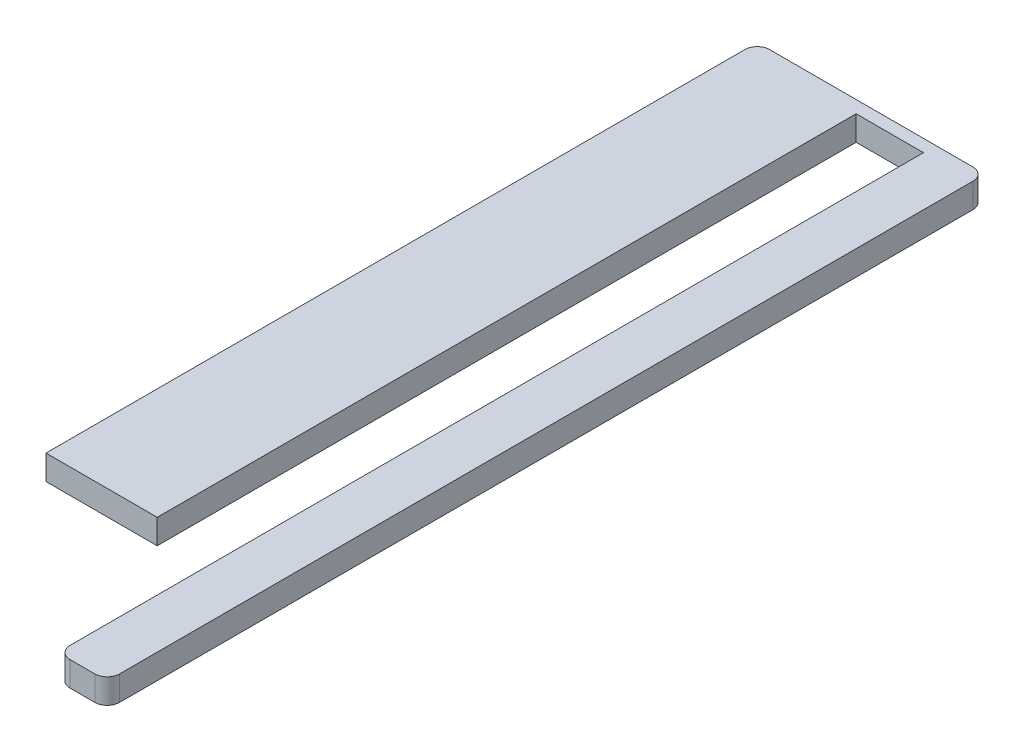
ISO-10303-21;
HEADER;
FILE_DESCRIPTION(('STEP AP214'),'2;1');
FILE_NAME('part.step','',(''),(''),'','','');
FILE_SCHEMA(('AUTOMOTIVE_DESIGN { 1 0 10303 214 1 1 1 1 }'));
ENDSEC;
DATA;
#1=APPLICATION_CONTEXT('core data for automotive mechanical design processes');
#2=APPLICATION_PROTOCOL_DEFINITION('international standard','automotive_design',2000,#1);
#3=PRODUCT_CONTEXT('',#1,'mechanical');
#4=PRODUCT('Part','Part','',(#3));
#5=PRODUCT_RELATED_PRODUCT_CATEGORY('part','',(#4));
#6=PRODUCT_DEFINITION_FORMATION('','',#4);
#7=PRODUCT_DEFINITION_CONTEXT('part definition',#1,'design');
#8=PRODUCT_DEFINITION('design','',#6,#7);
#9=PRODUCT_DEFINITION_SHAPE('','',#8);
#10=(LENGTH_UNIT() NAMED_UNIT(*) SI_UNIT(.MILLI.,.METRE.));
#11=(NAMED_UNIT(*) PLANE_ANGLE_UNIT() SI_UNIT($,.RADIAN.));
#12=(NAMED_UNIT(*) SI_UNIT($,.STERADIAN.) SOLID_ANGLE_UNIT());
#13=UNCERTAINTY_MEASURE_WITH_UNIT(LENGTH_MEASURE(1.E-05),#10,'distance_accuracy_value','');
#14=(GEOMETRIC_REPRESENTATION_CONTEXT(3) GLOBAL_UNCERTAINTY_ASSIGNED_CONTEXT((#13)) GLOBAL_UNIT_ASSIGNED_CONTEXT((#10,
#11,#12)) REPRESENTATION_CONTEXT('',''));
#15=CARTESIAN_POINT('',(0.,0.,0.));
#16=DIRECTION('',(0.,0.,1.));
#17=DIRECTION('',(1.,0.,0.));
#18=AXIS2_PLACEMENT_3D('',#15,#16,#17);
#19=CARTESIAN_POINT('',(0.,2.,-56.55));
#20=DIRECTION('',(1.,0.,0.));
#21=DIRECTION('',(0.,0.,-1.));
#22=AXIS2_PLACEMENT_3D('',#19,#20,#21);
#23=PLANE('',#22);
#24=DIRECTION('',(0.,0.,1.));
#25=VECTOR('',#24,1.);
#26=CARTESIAN_POINT('',(0.,0.,-56.55));
#27=LINE('',#26,#25);
#28=CARTESIAN_POINT('',(0.,0.,-56.55));
#29=VERTEX_POINT('',#28);
#30=CARTESIAN_POINT('',(0.,0.,0.));
#31=VERTEX_POINT('',#30);
#32=EDGE_CURVE('E170',#29,#31,#27,.T.);
#33=ORIENTED_EDGE('',*,*,#32,.T.);
#34=DIRECTION('',(0.,-1.,0.));
#35=VECTOR('',#34,1.);
#36=CARTESIAN_POINT('',(0.,2.,0.));
#37=LINE('',#36,#35);
#38=CARTESIAN_POINT('',(0.,2.,0.));
#39=VERTEX_POINT('',#38);
#40=EDGE_CURVE('E11',#39,#31,#37,.T.);
#41=ORIENTED_EDGE('',*,*,#40,.F.);
#42=DIRECTION('',(0.,0.,1.));
#43=VECTOR('',#42,1.);
#44=CARTESIAN_POINT('',(0.,2.,-56.55));
#45=LINE('',#44,#43);
#46=CARTESIAN_POINT('',(0.,2.,-56.55));
#47=VERTEX_POINT('',#46);
#48=EDGE_CURVE('E204',#47,#39,#45,.T.);
#49=ORIENTED_EDGE('',*,*,#48,.F.);
#50=DIRECTION('',(0.,-1.,0.));
#51=VECTOR('',#50,1.);
#52=CARTESIAN_POINT('',(0.,2.,-56.55));
#53=LINE('',#52,#51);
#54=EDGE_CURVE('E166',#47,#29,#53,.T.);
#55=ORIENTED_EDGE('',*,*,#54,.T.);
#56=EDGE_LOOP('',(#33,#41,#49,#55));
#57=FACE_BOUND('',#56,.T.);
#58=ADVANCED_FACE('F45',(#57),#23,.F.);
#59=CARTESIAN_POINT('',(0.,2.,0.));
#60=DIRECTION('',(0.,0.,-1.));
#61=DIRECTION('',(-1.,0.,0.));
#62=AXIS2_PLACEMENT_3D('',#59,#60,#61);
#63=PLANE('',#62);
#64=DIRECTION('',(1.,0.,0.));
#65=VECTOR('',#64,1.);
#66=CARTESIAN_POINT('',(0.,0.,0.));
#67=LINE('',#66,#65);
#68=CARTESIAN_POINT('',(9.,0.,0.));
#69=VERTEX_POINT('',#68);
#70=EDGE_CURVE('E174',#31,#69,#67,.T.);
#71=ORIENTED_EDGE('',*,*,#70,.T.);
#72=DIRECTION('',(0.,-1.,0.));
#73=VECTOR('',#72,1.);
#74=CARTESIAN_POINT('',(9.,2.,0.));
#75=LINE('',#74,#73);
#76=CARTESIAN_POINT('',(9.,2.,0.));
#77=VERTEX_POINT('',#76);
#78=EDGE_CURVE('E54',#77,#69,#75,.T.);
#79=ORIENTED_EDGE('',*,*,#78,.F.);
#80=DIRECTION('',(1.,0.,0.));
#81=VECTOR('',#80,1.);
#82=CARTESIAN_POINT('',(0.,2.,0.));
#83=LINE('',#82,#81);
#84=EDGE_CURVE('E117',#39,#77,#83,.T.);
#85=ORIENTED_EDGE('',*,*,#84,.F.);
#86=ORIENTED_EDGE('',*,*,#40,.T.);
#87=EDGE_LOOP('',(#71,#79,#85,#86));
#88=FACE_BOUND('',#87,.T.);
#89=ADVANCED_FACE('F298',(#88),#63,.F.);
#90=CARTESIAN_POINT('',(9.,2.,0.));
#91=DIRECTION('',(-1.,0.,0.));
#92=DIRECTION('',(0.,0.,1.));
#93=AXIS2_PLACEMENT_3D('',#90,#91,#92);
#94=PLANE('',#93);
#95=DIRECTION('',(0.,0.,-1.));
#96=VECTOR('',#95,1.);
#97=CARTESIAN_POINT('',(9.,0.,0.));
#98=LINE('',#97,#96);
#99=CARTESIAN_POINT('',(9.,0.,-56.55));
#100=VERTEX_POINT('',#99);
#101=EDGE_CURVE('E177',#69,#100,#98,.T.);
#102=ORIENTED_EDGE('',*,*,#101,.T.);
#103=DIRECTION('',(0.,-1.,0.));
#104=VECTOR('',#103,1.);
#105=CARTESIAN_POINT('',(9.,2.,-56.55));
#106=LINE('',#105,#104);
#107=CARTESIAN_POINT('',(9.,2.,-56.55));
#108=VERTEX_POINT('',#107);
#109=EDGE_CURVE('E231',#108,#100,#106,.T.);
#110=ORIENTED_EDGE('',*,*,#109,.F.);
#111=DIRECTION('',(0.,0.,-1.));
#112=VECTOR('',#111,1.);
#113=CARTESIAN_POINT('',(9.,2.,0.));
#114=LINE('',#113,#112);
#115=EDGE_CURVE('E241',#77,#108,#114,.T.);
#116=ORIENTED_EDGE('',*,*,#115,.F.);
#117=ORIENTED_EDGE('',*,*,#78,.T.);
#118=EDGE_LOOP('',(#102,#110,#116,#117));
#119=FACE_BOUND('',#118,.T.);
#120=ADVANCED_FACE('F239',(#119),#94,.F.);
#121=CARTESIAN_POINT('',(9.,2.,-56.55));
#122=DIRECTION('',(0.,0.,-1.));
#123=DIRECTION('',(-1.,0.,0.));
#124=AXIS2_PLACEMENT_3D('',#121,#122,#123);
#125=PLANE('',#124);
#126=DIRECTION('',(1.,0.,0.));
#127=VECTOR('',#126,1.);
#128=CARTESIAN_POINT('',(9.,0.,-56.55));
#129=LINE('',#128,#127);
#130=CARTESIAN_POINT('',(14.45,0.,-56.55));
#131=VERTEX_POINT('',#130);
#132=EDGE_CURVE('E180',#100,#131,#129,.T.);
#133=ORIENTED_EDGE('',*,*,#132,.T.);
#134=DIRECTION('',(0.,-1.,0.));
#135=VECTOR('',#134,1.);
#136=CARTESIAN_POINT('',(14.45,2.,-56.55));
#137=LINE('',#136,#135);
#138=CARTESIAN_POINT('',(14.45,2.,-56.55));
#139=VERTEX_POINT('',#138);
#140=EDGE_CURVE('E227',#139,#131,#137,.T.);
#141=ORIENTED_EDGE('',*,*,#140,.F.);
#142=DIRECTION('',(1.,0.,0.));
#143=VECTOR('',#142,1.);
#144=CARTESIAN_POINT('',(9.,2.,-56.55));
#145=LINE('',#144,#143);
#146=EDGE_CURVE('E260',#108,#139,#145,.T.);
#147=ORIENTED_EDGE('',*,*,#146,.F.);
#148=ORIENTED_EDGE('',*,*,#109,.T.);
#149=EDGE_LOOP('',(#133,#141,#147,#148));
#150=FACE_BOUND('',#149,.T.);
#151=ADVANCED_FACE('F250',(#150),#125,.F.);
#152=CARTESIAN_POINT('',(14.45,2.,-56.55));
#153=DIRECTION('',(1.,0.,0.));
#154=DIRECTION('',(0.,0.,-1.));
#155=AXIS2_PLACEMENT_3D('',#152,#153,#154);
#156=PLANE('',#155);
#157=DIRECTION('',(0.,0.,1.));
#158=VECTOR('',#157,1.);
#159=CARTESIAN_POINT('',(14.45,0.,-56.55));
#160=LINE('',#159,#158);
#161=CARTESIAN_POINT('',(14.45,0.,12.5));
#162=VERTEX_POINT('',#161);
#163=EDGE_CURVE('E183',#131,#162,#160,.T.);
#164=ORIENTED_EDGE('',*,*,#163,.T.);
#165=DIRECTION('',(0.,-1.,0.));
#166=VECTOR('',#165,1.);
#167=CARTESIAN_POINT('',(14.45,2.,12.5));
#168=LINE('',#167,#166);
#169=CARTESIAN_POINT('',(14.45,2.,12.5));
#170=VERTEX_POINT('',#169);
#171=EDGE_CURVE('E223',#170,#162,#168,.T.);
#172=ORIENTED_EDGE('',*,*,#171,.F.);
#173=DIRECTION('',(0.,0.,1.));
#174=VECTOR('',#173,1.);
#175=CARTESIAN_POINT('',(14.45,2.,-56.55));
#176=LINE('',#175,#174);
#177=EDGE_CURVE('E256',#139,#170,#176,.T.);
#178=ORIENTED_EDGE('',*,*,#177,.F.);
#179=ORIENTED_EDGE('',*,*,#140,.T.);
#180=EDGE_LOOP('',(#164,#172,#178,#179));
#181=FACE_BOUND('',#180,.T.);
#182=ADVANCED_FACE('F254',(#181),#156,.F.);
#183=CARTESIAN_POINT('',(15.45,2.,12.5));
#184=DIRECTION('',(0.,-1.,0.));
#185=DIRECTION('',(0.,0.,-1.));
#186=AXIS2_PLACEMENT_3D('',#183,#184,#185);
#187=CYLINDRICAL_SURFACE('',#186,1.);
#188=CARTESIAN_POINT('',(15.45,0.,12.5));
#189=DIRECTION('',(0.,1.,0.));
#190=DIRECTION('',(0.,0.,1.));
#191=AXIS2_PLACEMENT_3D('',#188,#189,#190);
#192=CIRCLE('',#191,1.);
#193=CARTESIAN_POINT('',(15.45,0.,13.5));
#194=VERTEX_POINT('',#193);
#195=EDGE_CURVE('E186',#162,#194,#192,.T.);
#196=ORIENTED_EDGE('',*,*,#195,.T.);
#197=DIRECTION('',(0.,-1.,0.));
#198=VECTOR('',#197,1.);
#199=CARTESIAN_POINT('',(15.45,2.,13.5));
#200=LINE('',#199,#198);
#201=CARTESIAN_POINT('',(15.45,2.,13.5));
#202=VERTEX_POINT('',#201);
#203=EDGE_CURVE('E219',#202,#194,#200,.T.);
#204=ORIENTED_EDGE('',*,*,#203,.F.);
#205=CARTESIAN_POINT('',(15.45,2.,12.5));
#206=DIRECTION('',(0.,1.,0.));
#207=DIRECTION('',(0.,0.,1.));
#208=AXIS2_PLACEMENT_3D('',#205,#206,#207);
#209=CIRCLE('',#208,1.);
#210=EDGE_CURVE('E259',#170,#202,#209,.T.);
#211=ORIENTED_EDGE('',*,*,#210,.F.);
#212=ORIENTED_EDGE('',*,*,#171,.T.);
#213=EDGE_LOOP('',(#196,#204,#211,#212));
#214=FACE_BOUND('',#213,.T.);
#215=ADVANCED_FACE('F311',(#214),#187,.T.);
#216=CARTESIAN_POINT('',(15.45,2.,13.5));
#217=DIRECTION('',(0.,0.,-1.));
#218=DIRECTION('',(-1.,0.,0.));
#219=AXIS2_PLACEMENT_3D('',#216,#217,#218);
#220=PLANE('',#219);
#221=DIRECTION('',(1.,0.,0.));
#222=VECTOR('',#221,1.);
#223=CARTESIAN_POINT('',(15.45,0.,13.5));
#224=LINE('',#223,#222);
#225=CARTESIAN_POINT('',(17.45,0.,13.5));
#226=VERTEX_POINT('',#225);
#227=EDGE_CURVE('E189',#194,#226,#224,.T.);
#228=ORIENTED_EDGE('',*,*,#227,.T.);
#229=DIRECTION('',(0.,-1.,0.));
#230=VECTOR('',#229,1.);
#231=CARTESIAN_POINT('',(17.45,2.,13.5));
#232=LINE('',#231,#230);
#233=CARTESIAN_POINT('',(17.45,2.,13.5));
#234=VERTEX_POINT('',#233);
#235=EDGE_CURVE('E215',#234,#226,#232,.T.);
#236=ORIENTED_EDGE('',*,*,#235,.F.);
#237=DIRECTION('',(1.,0.,0.));
#238=VECTOR('',#237,1.);
#239=CARTESIAN_POINT('',(15.45,2.,13.5));
#240=LINE('',#239,#238);
#241=EDGE_CURVE('E264',#202,#234,#240,.T.);
#242=ORIENTED_EDGE('',*,*,#241,.F.);
#243=ORIENTED_EDGE('',*,*,#203,.T.);
#244=EDGE_LOOP('',(#228,#236,#242,#243));
#245=FACE_BOUND('',#244,.T.);
#246=ADVANCED_FACE('F314',(#245),#220,.F.);
#247=CARTESIAN_POINT('',(17.45,2.,12.5));
#248=DIRECTION('',(0.,-1.,0.));
#249=DIRECTION('',(0.,0.,-1.));
#250=AXIS2_PLACEMENT_3D('',#247,#248,#249);
#251=CYLINDRICAL_SURFACE('',#250,1.);
#252=CARTESIAN_POINT('',(17.45,0.,12.5));
#253=DIRECTION('',(0.,1.,0.));
#254=DIRECTION('',(0.,0.,1.));
#255=AXIS2_PLACEMENT_3D('',#252,#253,#254);
#256=CIRCLE('',#255,1.);
#257=CARTESIAN_POINT('',(18.45,0.,12.5));
#258=VERTEX_POINT('',#257);
#259=EDGE_CURVE('E192',#226,#258,#256,.T.);
#260=ORIENTED_EDGE('',*,*,#259,.T.);
#261=DIRECTION('',(0.,-1.,0.));
#262=VECTOR('',#261,1.);
#263=CARTESIAN_POINT('',(18.45,2.,12.5));
#264=LINE('',#263,#262);
#265=CARTESIAN_POINT('',(18.45,2.,12.5));
#266=VERTEX_POINT('',#265);
#267=EDGE_CURVE('E211',#266,#258,#264,.T.);
#268=ORIENTED_EDGE('',*,*,#267,.F.);
#269=CARTESIAN_POINT('',(17.45,2.,12.5));
#270=DIRECTION('',(0.,1.,0.));
#271=DIRECTION('',(0.,0.,1.));
#272=AXIS2_PLACEMENT_3D('',#269,#270,#271);
#273=CIRCLE('',#272,1.);
#274=EDGE_CURVE('E271',#234,#266,#273,.T.);
#275=ORIENTED_EDGE('',*,*,#274,.F.);
#276=ORIENTED_EDGE('',*,*,#235,.T.);
#277=EDGE_LOOP('',(#260,#268,#275,#276));
#278=FACE_BOUND('',#277,.T.);
#279=ADVANCED_FACE('F279',(#278),#251,.T.);
#280=CARTESIAN_POINT('',(18.45,2.,12.5));
#281=DIRECTION('',(-1.,0.,0.));
#282=DIRECTION('',(0.,0.,1.));
#283=AXIS2_PLACEMENT_3D('',#280,#281,#282);
#284=PLANE('',#283);
#285=DIRECTION('',(0.,0.,-1.));
#286=VECTOR('',#285,1.);
#287=CARTESIAN_POINT('',(18.45,0.,12.5));
#288=LINE('',#287,#286);
#289=CARTESIAN_POINT('',(18.45,0.,-56.55));
#290=VERTEX_POINT('',#289);
#291=EDGE_CURVE('E195',#258,#290,#288,.T.);
#292=ORIENTED_EDGE('',*,*,#291,.T.);
#293=DIRECTION('',(0.,-1.,0.));
#294=VECTOR('',#293,1.);
#295=CARTESIAN_POINT('',(18.45,2.,-56.55));
#296=LINE('',#295,#294);
#297=CARTESIAN_POINT('',(18.45,2.,-56.55));
#298=VERTEX_POINT('',#297);
#299=EDGE_CURVE('E159',#298,#290,#296,.T.);
#300=ORIENTED_EDGE('',*,*,#299,.F.);
#301=DIRECTION('',(0.,0.,-1.));
#302=VECTOR('',#301,1.);
#303=CARTESIAN_POINT('',(18.45,2.,12.5));
#304=LINE('',#303,#302);
#305=EDGE_CURVE('E148',#266,#298,#304,.T.);
#306=ORIENTED_EDGE('',*,*,#305,.F.);
#307=ORIENTED_EDGE('',*,*,#267,.T.);
#308=EDGE_LOOP('',(#292,#300,#306,#307));
#309=FACE_BOUND('',#308,.T.);
#310=ADVANCED_FACE('F283',(#309),#284,.F.);
#311=CARTESIAN_POINT('',(17.45,2.,-56.55));
#312=DIRECTION('',(0.,-1.,0.));
#313=DIRECTION('',(0.,0.,-1.));
#314=AXIS2_PLACEMENT_3D('',#311,#312,#313);
#315=CYLINDRICAL_SURFACE('',#314,1.);
#316=CARTESIAN_POINT('',(17.45,0.,-56.55));
#317=DIRECTION('',(0.,1.,0.));
#318=DIRECTION('',(0.,0.,1.));
#319=AXIS2_PLACEMENT_3D('',#316,#317,#318);
#320=CIRCLE('',#319,1.);
#321=CARTESIAN_POINT('',(17.45,0.,-57.55));
#322=VERTEX_POINT('',#321);
#323=EDGE_CURVE('E157',#290,#322,#320,.T.);
#324=ORIENTED_EDGE('',*,*,#323,.T.);
#325=DIRECTION('',(0.,-1.,0.));
#326=VECTOR('',#325,1.);
#327=CARTESIAN_POINT('',(17.45,2.,-57.55));
#328=LINE('',#327,#326);
#329=CARTESIAN_POINT('',(17.45,2.,-57.55));
#330=VERTEX_POINT('',#329);
#331=EDGE_CURVE('E154',#330,#322,#328,.T.);
#332=ORIENTED_EDGE('',*,*,#331,.F.);
#333=CARTESIAN_POINT('',(17.45,2.,-56.55));
#334=DIRECTION('',(0.,1.,0.));
#335=DIRECTION('',(0.,0.,1.));
#336=AXIS2_PLACEMENT_3D('',#333,#334,#335);
#337=CIRCLE('',#336,1.);
#338=EDGE_CURVE('E142',#298,#330,#337,.T.);
#339=ORIENTED_EDGE('',*,*,#338,.F.);
#340=ORIENTED_EDGE('',*,*,#299,.T.);
#341=EDGE_LOOP('',(#324,#332,#339,#340));
#342=FACE_BOUND('',#341,.T.);
#343=ADVANCED_FACE('F155',(#342),#315,.T.);
#344=CARTESIAN_POINT('',(17.45,2.,-57.55));
#345=DIRECTION('',(0.,0.,1.));
#346=DIRECTION('',(1.,0.,0.));
#347=AXIS2_PLACEMENT_3D('',#344,#345,#346);
#348=PLANE('',#347);
#349=DIRECTION('',(-1.,0.,0.));
#350=VECTOR('',#349,1.);
#351=CARTESIAN_POINT('',(17.45,0.,-57.55));
#352=LINE('',#351,#350);
#353=CARTESIAN_POINT('',(1.,0.,-57.55));
#354=VERTEX_POINT('',#353);
#355=EDGE_CURVE('E103',#322,#354,#352,.T.);
#356=ORIENTED_EDGE('',*,*,#355,.T.);
#357=DIRECTION('',(0.,-1.,0.));
#358=VECTOR('',#357,1.);
#359=CARTESIAN_POINT('',(1.,2.,-57.55));
#360=LINE('',#359,#358);
#361=CARTESIAN_POINT('',(1.,2.,-57.55));
#362=VERTEX_POINT('',#361);
#363=EDGE_CURVE('E160',#362,#354,#360,.T.);
#364=ORIENTED_EDGE('',*,*,#363,.F.);
#365=DIRECTION('',(-1.,0.,0.));
#366=VECTOR('',#365,1.);
#367=CARTESIAN_POINT('',(17.45,2.,-57.55));
#368=LINE('',#367,#366);
#369=EDGE_CURVE('E146',#330,#362,#368,.T.);
#370=ORIENTED_EDGE('',*,*,#369,.F.);
#371=ORIENTED_EDGE('',*,*,#331,.T.);
#372=EDGE_LOOP('',(#356,#364,#370,#371));
#373=FACE_BOUND('',#372,.T.);
#374=ADVANCED_FACE('F162',(#373),#348,.F.);
#375=CARTESIAN_POINT('',(1.,2.,-56.55));
#376=DIRECTION('',(0.,-1.,0.));
#377=DIRECTION('',(0.,0.,-1.));
#378=AXIS2_PLACEMENT_3D('',#375,#376,#377);
#379=CYLINDRICAL_SURFACE('',#378,1.);
#380=CARTESIAN_POINT('',(1.,0.,-56.55));
#381=DIRECTION('',(0.,1.,0.));
#382=DIRECTION('',(0.,0.,1.));
#383=AXIS2_PLACEMENT_3D('',#380,#381,#382);
#384=CIRCLE('',#383,1.);
#385=EDGE_CURVE('E109',#354,#29,#384,.T.);
#386=ORIENTED_EDGE('',*,*,#385,.T.);
#387=ORIENTED_EDGE('',*,*,#54,.F.);
#388=CARTESIAN_POINT('',(1.,2.,-56.55));
#389=DIRECTION('',(0.,1.,0.));
#390=DIRECTION('',(0.,0.,1.));
#391=AXIS2_PLACEMENT_3D('',#388,#389,#390);
#392=CIRCLE('',#391,1.);
#393=EDGE_CURVE('E62',#362,#47,#392,.T.);
#394=ORIENTED_EDGE('',*,*,#393,.F.);
#395=ORIENTED_EDGE('',*,*,#363,.T.);
#396=EDGE_LOOP('',(#386,#387,#394,#395));
#397=FACE_BOUND('',#396,.T.);
#398=ADVANCED_FACE('F287',(#397),#379,.T.);
#399=CARTESIAN_POINT('',(15.45,2.,12.5));
#400=DIRECTION('',(0.,1.,0.));
#401=DIRECTION('',(0.,0.,1.));
#402=AXIS2_PLACEMENT_3D('',#399,#400,#401);
#403=PLANE('',#402);
#404=ORIENTED_EDGE('',*,*,#48,.T.);
#405=ORIENTED_EDGE('',*,*,#84,.T.);
#406=ORIENTED_EDGE('',*,*,#115,.T.);
#407=ORIENTED_EDGE('',*,*,#146,.T.);
#408=ORIENTED_EDGE('',*,*,#177,.T.);
#409=ORIENTED_EDGE('',*,*,#210,.T.);
#410=ORIENTED_EDGE('',*,*,#241,.T.);
#411=ORIENTED_EDGE('',*,*,#274,.T.);
#412=ORIENTED_EDGE('',*,*,#305,.T.);
#413=ORIENTED_EDGE('',*,*,#338,.T.);
#414=ORIENTED_EDGE('',*,*,#369,.T.);
#415=ORIENTED_EDGE('',*,*,#393,.T.);
#416=EDGE_LOOP('',(#404,#405,#406,#407,#408,#409,#410,#411,#412,#413,#414,#415));
#417=FACE_BOUND('',#416,.T.);
#418=ADVANCED_FACE('F144',(#417),#403,.T.);
#419=CARTESIAN_POINT('',(15.45,0.,12.5));
#420=DIRECTION('',(0.,1.,0.));
#421=DIRECTION('',(0.,0.,1.));
#422=AXIS2_PLACEMENT_3D('',#419,#420,#421);
#423=PLANE('',#422);
#424=ORIENTED_EDGE('',*,*,#32,.F.);
#425=ORIENTED_EDGE('',*,*,#385,.F.);
#426=ORIENTED_EDGE('',*,*,#355,.F.);
#427=ORIENTED_EDGE('',*,*,#323,.F.);
#428=ORIENTED_EDGE('',*,*,#291,.F.);
#429=ORIENTED_EDGE('',*,*,#259,.F.);
#430=ORIENTED_EDGE('',*,*,#227,.F.);
#431=ORIENTED_EDGE('',*,*,#195,.F.);
#432=ORIENTED_EDGE('',*,*,#163,.F.);
#433=ORIENTED_EDGE('',*,*,#132,.F.);
#434=ORIENTED_EDGE('',*,*,#101,.F.);
#435=ORIENTED_EDGE('',*,*,#70,.F.);
#436=EDGE_LOOP('',(#424,#425,#426,#427,#428,#429,#430,#431,#432,#433,#434,#435));
#437=FACE_BOUND('',#436,.T.);
#438=ADVANCED_FACE('F245',(#437),#423,.F.);
#439=CLOSED_SHELL('',(#58,#89,#120,#151,#182,#215,#246,#279,#310,#343,#374,#398,#418,#438));
#440=MANIFOLD_SOLID_BREP('B2',#439);
#441=ADVANCED_BREP_SHAPE_REPRESENTATION('',(#18,#440),#14);
#442=SHAPE_DEFINITION_REPRESENTATION(#9,#441);
ENDSEC;
END-ISO-10303-21;
